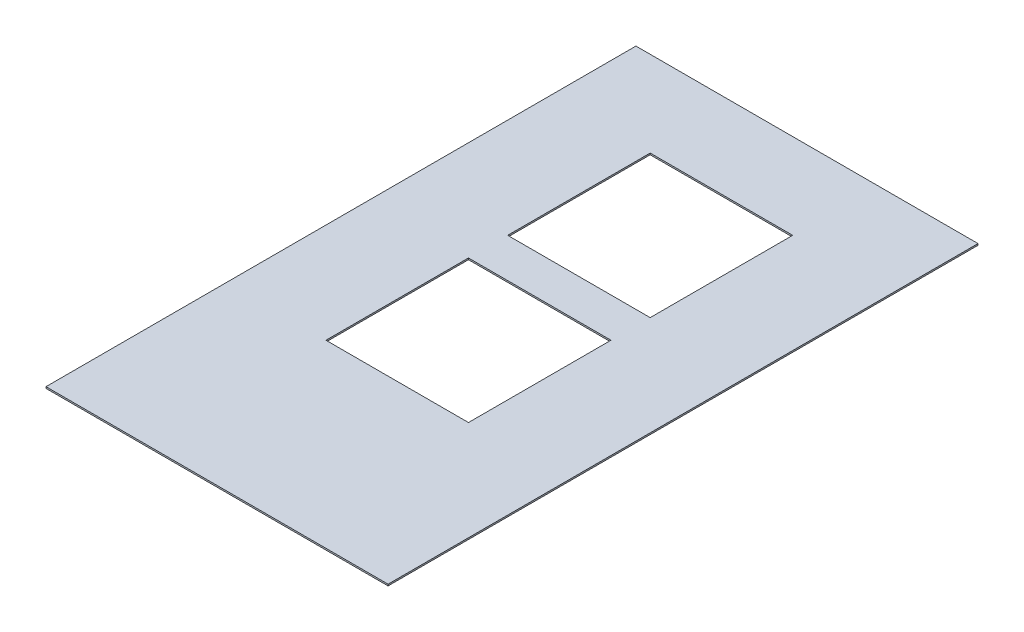
ISO-10303-21;
HEADER;
FILE_DESCRIPTION(('STEP AP214'),'2;1');
FILE_NAME('part.step','',(''),(''),'','','');
FILE_SCHEMA(('AUTOMOTIVE_DESIGN { 1 0 10303 214 1 1 1 1 }'));
ENDSEC;
DATA;
#1=APPLICATION_CONTEXT('core data for automotive mechanical design processes');
#2=APPLICATION_PROTOCOL_DEFINITION('international standard','automotive_design',2000,#1);
#3=PRODUCT_CONTEXT('',#1,'mechanical');
#4=PRODUCT('Part','Part','',(#3));
#5=PRODUCT_RELATED_PRODUCT_CATEGORY('part','',(#4));
#6=PRODUCT_DEFINITION_FORMATION('','',#4);
#7=PRODUCT_DEFINITION_CONTEXT('part definition',#1,'design');
#8=PRODUCT_DEFINITION('design','',#6,#7);
#9=PRODUCT_DEFINITION_SHAPE('','',#8);
#10=(LENGTH_UNIT() NAMED_UNIT(*) SI_UNIT(.MILLI.,.METRE.));
#11=(NAMED_UNIT(*) PLANE_ANGLE_UNIT() SI_UNIT($,.RADIAN.));
#12=(NAMED_UNIT(*) SI_UNIT($,.STERADIAN.) SOLID_ANGLE_UNIT());
#13=UNCERTAINTY_MEASURE_WITH_UNIT(LENGTH_MEASURE(1.E-05),#10,'distance_accuracy_value','');
#14=(GEOMETRIC_REPRESENTATION_CONTEXT(3) GLOBAL_UNCERTAINTY_ASSIGNED_CONTEXT((#13)) GLOBAL_UNIT_ASSIGNED_CONTEXT((#10,
#11,#12)) REPRESENTATION_CONTEXT('',''));
#15=CARTESIAN_POINT('',(0.,0.,0.));
#16=DIRECTION('',(0.,0.,1.));
#17=DIRECTION('',(1.,0.,0.));
#18=AXIS2_PLACEMENT_3D('',#15,#16,#17);
#19=CARTESIAN_POINT('',(609.6,5.55625,1051.321875));
#20=DIRECTION('',(-1.,0.,0.));
#21=DIRECTION('',(0.,0.,1.));
#22=AXIS2_PLACEMENT_3D('',#19,#20,#21);
#23=PLANE('',#22);
#24=DIRECTION('',(0.,0.,-1.));
#25=VECTOR('',#24,1.);
#26=CARTESIAN_POINT('',(609.6,0.,1051.321875));
#27=LINE('',#26,#25);
#28=CARTESIAN_POINT('',(609.6,0.,1051.321875));
#29=VERTEX_POINT('',#28);
#30=CARTESIAN_POINT('',(609.6,0.,-1051.321875));
#31=VERTEX_POINT('',#30);
#32=EDGE_CURVE('E159',#29,#31,#27,.T.);
#33=ORIENTED_EDGE('',*,*,#32,.T.);
#34=DIRECTION('',(0.,-1.,0.));
#35=VECTOR('',#34,1.);
#36=CARTESIAN_POINT('',(609.6,5.55625,-1051.321875));
#37=LINE('',#36,#35);
#38=CARTESIAN_POINT('',(609.6,5.55625,-1051.321875));
#39=VERTEX_POINT('',#38);
#40=EDGE_CURVE('E206',#39,#31,#37,.T.);
#41=ORIENTED_EDGE('',*,*,#40,.F.);
#42=DIRECTION('',(0.,0.,-1.));
#43=VECTOR('',#42,1.);
#44=CARTESIAN_POINT('',(609.6,5.55625,1051.321875));
#45=LINE('',#44,#43);
#46=CARTESIAN_POINT('',(609.6,5.55625,1051.321875));
#47=VERTEX_POINT('',#46);
#48=EDGE_CURVE('E180',#47,#39,#45,.T.);
#49=ORIENTED_EDGE('',*,*,#48,.F.);
#50=DIRECTION('',(0.,-1.,0.));
#51=VECTOR('',#50,1.);
#52=CARTESIAN_POINT('',(609.6,5.55625,1051.321875));
#53=LINE('',#52,#51);
#54=EDGE_CURVE('E190',#47,#29,#53,.T.);
#55=ORIENTED_EDGE('',*,*,#54,.T.);
#56=EDGE_LOOP('',(#33,#41,#49,#55));
#57=FACE_BOUND('',#56,.T.);
#58=ADVANCED_FACE('F39',(#57),#23,.F.);
#59=CARTESIAN_POINT('',(-609.6,5.55625,-1051.321875));
#60=DIRECTION('',(0.,0.,1.));
#61=DIRECTION('',(1.,0.,0.));
#62=AXIS2_PLACEMENT_3D('',#59,#60,#61);
#63=PLANE('',#62);
#64=DIRECTION('',(-1.,0.,0.));
#65=VECTOR('',#64,1.);
#66=CARTESIAN_POINT('',(-609.6,0.,-1051.321875));
#67=LINE('',#66,#65);
#68=CARTESIAN_POINT('',(-609.6,0.,-1051.321875));
#69=VERTEX_POINT('',#68);
#70=EDGE_CURVE('E193',#31,#69,#67,.T.);
#71=ORIENTED_EDGE('',*,*,#70,.T.);
#72=DIRECTION('',(0.,-1.,0.));
#73=VECTOR('',#72,1.);
#74=CARTESIAN_POINT('',(-609.6,5.55625,-1051.321875));
#75=LINE('',#74,#73);
#76=CARTESIAN_POINT('',(-609.6,5.55625,-1051.321875));
#77=VERTEX_POINT('',#76);
#78=EDGE_CURVE('E203',#77,#69,#75,.T.);
#79=ORIENTED_EDGE('',*,*,#78,.F.);
#80=DIRECTION('',(-1.,0.,0.));
#81=VECTOR('',#80,1.);
#82=CARTESIAN_POINT('',(-609.6,5.55625,-1051.321875));
#83=LINE('',#82,#81);
#84=EDGE_CURVE('E183',#39,#77,#83,.T.);
#85=ORIENTED_EDGE('',*,*,#84,.F.);
#86=ORIENTED_EDGE('',*,*,#40,.T.);
#87=EDGE_LOOP('',(#71,#79,#85,#86));
#88=FACE_BOUND('',#87,.T.);
#89=ADVANCED_FACE('F238',(#88),#63,.F.);
#90=CARTESIAN_POINT('',(-609.6,5.55625,1051.321875));
#91=DIRECTION('',(1.,0.,0.));
#92=DIRECTION('',(0.,0.,-1.));
#93=AXIS2_PLACEMENT_3D('',#90,#91,#92);
#94=PLANE('',#93);
#95=DIRECTION('',(0.,0.,1.));
#96=VECTOR('',#95,1.);
#97=CARTESIAN_POINT('',(-609.6,0.,1051.321875));
#98=LINE('',#97,#96);
#99=CARTESIAN_POINT('',(-609.6,0.,1051.321875));
#100=VERTEX_POINT('',#99);
#101=EDGE_CURVE('E195',#69,#100,#98,.T.);
#102=ORIENTED_EDGE('',*,*,#101,.T.);
#103=DIRECTION('',(0.,-1.,0.));
#104=VECTOR('',#103,1.);
#105=CARTESIAN_POINT('',(-609.6,5.55625,1051.321875));
#106=LINE('',#105,#104);
#107=CARTESIAN_POINT('',(-609.6,5.55625,1051.321875));
#108=VERTEX_POINT('',#107);
#109=EDGE_CURVE('E200',#108,#100,#106,.T.);
#110=ORIENTED_EDGE('',*,*,#109,.F.);
#111=DIRECTION('',(0.,0.,1.));
#112=VECTOR('',#111,1.);
#113=CARTESIAN_POINT('',(-609.6,5.55625,1051.321875));
#114=LINE('',#113,#112);
#115=EDGE_CURVE('E186',#77,#108,#114,.T.);
#116=ORIENTED_EDGE('',*,*,#115,.F.);
#117=ORIENTED_EDGE('',*,*,#78,.T.);
#118=EDGE_LOOP('',(#102,#110,#116,#117));
#119=FACE_BOUND('',#118,.T.);
#120=ADVANCED_FACE('F243',(#119),#94,.F.);
#121=CARTESIAN_POINT('',(-609.6,5.55625,1051.321875));
#122=DIRECTION('',(0.,0.,-1.));
#123=DIRECTION('',(-1.,0.,0.));
#124=AXIS2_PLACEMENT_3D('',#121,#122,#123);
#125=PLANE('',#124);
#126=DIRECTION('',(1.,0.,0.));
#127=VECTOR('',#126,1.);
#128=CARTESIAN_POINT('',(-609.6,0.,1051.321875));
#129=LINE('',#128,#127);
#130=EDGE_CURVE('E184',#100,#29,#129,.T.);
#131=ORIENTED_EDGE('',*,*,#130,.T.);
#132=ORIENTED_EDGE('',*,*,#54,.F.);
#133=DIRECTION('',(1.,0.,0.));
#134=VECTOR('',#133,1.);
#135=CARTESIAN_POINT('',(-609.6,5.55625,1051.321875));
#136=LINE('',#135,#134);
#137=EDGE_CURVE('E188',#108,#47,#136,.T.);
#138=ORIENTED_EDGE('',*,*,#137,.F.);
#139=ORIENTED_EDGE('',*,*,#109,.T.);
#140=EDGE_LOOP('',(#131,#132,#138,#139));
#141=FACE_BOUND('',#140,.T.);
#142=ADVANCED_FACE('F258',(#141),#125,.F.);
#143=CARTESIAN_POINT('',(0.,5.55625,0.));
#144=DIRECTION('',(0.,-1.,0.));
#145=DIRECTION('',(0.,0.,-1.));
#146=AXIS2_PLACEMENT_3D('',#143,#144,#145);
#147=PLANE('',#146);
#148=DIRECTION('',(-1.,0.,0.));
#149=VECTOR('',#148,1.);
#150=CARTESIAN_POINT('',(254.000000000144,5.55625,-238.521875000141));
#151=LINE('',#150,#149);
#152=CARTESIAN_POINT('',(254.000000000144,5.55625,-238.521875000141));
#153=VERTEX_POINT('',#152);
#154=CARTESIAN_POINT('',(-253.999999999856,5.55625,-238.521875000141));
#155=VERTEX_POINT('',#154);
#156=EDGE_CURVE('E139',#153,#155,#151,.T.);
#157=ORIENTED_EDGE('',*,*,#156,.T.);
#158=DIRECTION('',(0.,0.,-1.));
#159=VECTOR('',#158,1.);
#160=CARTESIAN_POINT('',(-253.999999999856,5.55625,-238.521875000141));
#161=LINE('',#160,#159);
#162=CARTESIAN_POINT('',(-253.999999999856,5.55625,-746.521875000141));
#163=VERTEX_POINT('',#162);
#164=EDGE_CURVE('E133',#155,#163,#161,.T.);
#165=ORIENTED_EDGE('',*,*,#164,.T.);
#166=DIRECTION('',(1.,0.,0.));
#167=VECTOR('',#166,1.);
#168=CARTESIAN_POINT('',(254.000000000144,5.55625,-746.521875000141));
#169=LINE('',#168,#167);
#170=CARTESIAN_POINT('',(254.000000000144,5.55625,-746.521875000141));
#171=VERTEX_POINT('',#170);
#172=EDGE_CURVE('E142',#163,#171,#169,.T.);
#173=ORIENTED_EDGE('',*,*,#172,.T.);
#174=DIRECTION('',(0.,0.,1.));
#175=VECTOR('',#174,1.);
#176=CARTESIAN_POINT('',(254.000000000144,5.55625,-238.521875000141));
#177=LINE('',#176,#175);
#178=EDGE_CURVE('E53',#171,#153,#177,.T.);
#179=ORIENTED_EDGE('',*,*,#178,.T.);
#180=EDGE_LOOP('',(#157,#165,#173,#179));
#181=FACE_BOUND('',#180,.T.);
#182=DIRECTION('',(-1.,0.,0.));
#183=VECTOR('',#182,1.);
#184=CARTESIAN_POINT('',(254.,5.55625,409.178125));
#185=LINE('',#184,#183);
#186=CARTESIAN_POINT('',(254.,5.55625,409.178125));
#187=VERTEX_POINT('',#186);
#188=CARTESIAN_POINT('',(-254.,5.55625,409.178125));
#189=VERTEX_POINT('',#188);
#190=EDGE_CURVE('E166',#187,#189,#185,.T.);
#191=ORIENTED_EDGE('',*,*,#190,.T.);
#192=DIRECTION('',(0.,0.,-1.));
#193=VECTOR('',#192,1.);
#194=CARTESIAN_POINT('',(-254.,5.55625,409.178125));
#195=LINE('',#194,#193);
#196=CARTESIAN_POINT('',(-254.,5.55625,-98.8218749999997));
#197=VERTEX_POINT('',#196);
#198=EDGE_CURVE('E149',#189,#197,#195,.T.);
#199=ORIENTED_EDGE('',*,*,#198,.T.);
#200=DIRECTION('',(1.,0.,0.));
#201=VECTOR('',#200,1.);
#202=CARTESIAN_POINT('',(254.,5.55625,-98.8218749999997));
#203=LINE('',#202,#201);
#204=CARTESIAN_POINT('',(254.,5.55625,-98.8218749999997));
#205=VERTEX_POINT('',#204);
#206=EDGE_CURVE('E152',#197,#205,#203,.T.);
#207=ORIENTED_EDGE('',*,*,#206,.T.);
#208=DIRECTION('',(0.,0.,1.));
#209=VECTOR('',#208,1.);
#210=CARTESIAN_POINT('',(254.,5.55625,409.178125));
#211=LINE('',#210,#209);
#212=EDGE_CURVE('E61',#205,#187,#211,.T.);
#213=ORIENTED_EDGE('',*,*,#212,.T.);
#214=EDGE_LOOP('',(#191,#199,#207,#213));
#215=FACE_BOUND('',#214,.T.);
#216=ORIENTED_EDGE('',*,*,#48,.T.);
#217=ORIENTED_EDGE('',*,*,#84,.T.);
#218=ORIENTED_EDGE('',*,*,#115,.T.);
#219=ORIENTED_EDGE('',*,*,#137,.T.);
#220=EDGE_LOOP('',(#216,#217,#218,#219));
#221=FACE_BOUND('',#220,.T.);
#222=ADVANCED_FACE('F146',(#181,#215,#221),#147,.F.);
#223=CARTESIAN_POINT('',(0.,0.,0.));
#224=DIRECTION('',(0.,-1.,0.));
#225=DIRECTION('',(0.,0.,-1.));
#226=AXIS2_PLACEMENT_3D('',#223,#224,#225);
#227=PLANE('',#226);
#228=DIRECTION('',(0.,0.,-1.));
#229=VECTOR('',#228,1.);
#230=CARTESIAN_POINT('',(-253.999999999856,0.,0.));
#231=LINE('',#230,#229);
#232=CARTESIAN_POINT('',(-253.999999999856,0.,-238.521875000141));
#233=VERTEX_POINT('',#232);
#234=CARTESIAN_POINT('',(-253.999999999856,0.,-746.521875000141));
#235=VERTEX_POINT('',#234);
#236=EDGE_CURVE('E11',#233,#235,#231,.T.);
#237=ORIENTED_EDGE('',*,*,#236,.F.);
#238=DIRECTION('',(-1.,0.,0.));
#239=VECTOR('',#238,1.);
#240=CARTESIAN_POINT('',(0.,0.,-238.521875000141));
#241=LINE('',#240,#239);
#242=CARTESIAN_POINT('',(254.000000000144,0.,-238.521875000141));
#243=VERTEX_POINT('',#242);
#244=EDGE_CURVE('E46',#243,#233,#241,.T.);
#245=ORIENTED_EDGE('',*,*,#244,.F.);
#246=DIRECTION('',(0.,0.,1.));
#247=VECTOR('',#246,1.);
#248=CARTESIAN_POINT('',(254.000000000144,0.,0.));
#249=LINE('',#248,#247);
#250=CARTESIAN_POINT('',(254.000000000144,0.,-746.521875000141));
#251=VERTEX_POINT('',#250);
#252=EDGE_CURVE('E220',#251,#243,#249,.T.);
#253=ORIENTED_EDGE('',*,*,#252,.F.);
#254=DIRECTION('',(1.,0.,0.));
#255=VECTOR('',#254,1.);
#256=CARTESIAN_POINT('',(0.,0.,-746.521875000141));
#257=LINE('',#256,#255);
#258=EDGE_CURVE('E218',#235,#251,#257,.T.);
#259=ORIENTED_EDGE('',*,*,#258,.F.);
#260=EDGE_LOOP('',(#237,#245,#253,#259));
#261=FACE_BOUND('',#260,.T.);
#262=DIRECTION('',(0.,0.,-1.));
#263=VECTOR('',#262,1.);
#264=CARTESIAN_POINT('',(-254.,0.,0.));
#265=LINE('',#264,#263);
#266=CARTESIAN_POINT('',(-254.,0.,409.178125));
#267=VERTEX_POINT('',#266);
#268=CARTESIAN_POINT('',(-254.,0.,-98.8218749999997));
#269=VERTEX_POINT('',#268);
#270=EDGE_CURVE('E215',#267,#269,#265,.T.);
#271=ORIENTED_EDGE('',*,*,#270,.F.);
#272=DIRECTION('',(-1.,0.,0.));
#273=VECTOR('',#272,1.);
#274=CARTESIAN_POINT('',(0.,0.,409.178125));
#275=LINE('',#274,#273);
#276=CARTESIAN_POINT('',(254.,0.,409.178125));
#277=VERTEX_POINT('',#276);
#278=EDGE_CURVE('E213',#277,#267,#275,.T.);
#279=ORIENTED_EDGE('',*,*,#278,.F.);
#280=DIRECTION('',(0.,0.,1.));
#281=VECTOR('',#280,1.);
#282=CARTESIAN_POINT('',(254.,0.,0.));
#283=LINE('',#282,#281);
#284=CARTESIAN_POINT('',(254.,0.,-98.8218749999997));
#285=VERTEX_POINT('',#284);
#286=EDGE_CURVE('E211',#285,#277,#283,.T.);
#287=ORIENTED_EDGE('',*,*,#286,.F.);
#288=DIRECTION('',(1.,0.,0.));
#289=VECTOR('',#288,1.);
#290=CARTESIAN_POINT('',(0.,0.,-98.8218749999997));
#291=LINE('',#290,#289);
#292=EDGE_CURVE('E209',#269,#285,#291,.T.);
#293=ORIENTED_EDGE('',*,*,#292,.F.);
#294=EDGE_LOOP('',(#271,#279,#287,#293));
#295=FACE_BOUND('',#294,.T.);
#296=ORIENTED_EDGE('',*,*,#32,.F.);
#297=ORIENTED_EDGE('',*,*,#130,.F.);
#298=ORIENTED_EDGE('',*,*,#101,.F.);
#299=ORIENTED_EDGE('',*,*,#70,.F.);
#300=EDGE_LOOP('',(#296,#297,#298,#299));
#301=FACE_BOUND('',#300,.T.);
#302=ADVANCED_FACE('F226',(#261,#295,#301),#227,.T.);
#303=CARTESIAN_POINT('',(-254.,5.55625,409.178125));
#304=DIRECTION('',(-1.,0.,0.));
#305=DIRECTION('',(0.,0.,1.));
#306=AXIS2_PLACEMENT_3D('',#303,#304,#305);
#307=PLANE('',#306);
#308=ORIENTED_EDGE('',*,*,#270,.T.);
#309=DIRECTION('',(0.,-1.,0.));
#310=VECTOR('',#309,1.);
#311=CARTESIAN_POINT('',(-254.,5.55625,-98.8218749999997));
#312=LINE('',#311,#310);
#313=EDGE_CURVE('E164',#197,#269,#312,.T.);
#314=ORIENTED_EDGE('',*,*,#313,.F.);
#315=ORIENTED_EDGE('',*,*,#198,.F.);
#316=DIRECTION('',(0.,-1.,0.));
#317=VECTOR('',#316,1.);
#318=CARTESIAN_POINT('',(-254.,5.55625,409.178125));
#319=LINE('',#318,#317);
#320=EDGE_CURVE('E172',#189,#267,#319,.T.);
#321=ORIENTED_EDGE('',*,*,#320,.T.);
#322=EDGE_LOOP('',(#308,#314,#315,#321));
#323=FACE_BOUND('',#322,.T.);
#324=ADVANCED_FACE('F269',(#323),#307,.F.);
#325=CARTESIAN_POINT('',(254.,5.55625,409.178125));
#326=DIRECTION('',(0.,0.,1.));
#327=DIRECTION('',(1.,0.,0.));
#328=AXIS2_PLACEMENT_3D('',#325,#326,#327);
#329=PLANE('',#328);
#330=ORIENTED_EDGE('',*,*,#278,.T.);
#331=ORIENTED_EDGE('',*,*,#320,.F.);
#332=ORIENTED_EDGE('',*,*,#190,.F.);
#333=DIRECTION('',(0.,-1.,0.));
#334=VECTOR('',#333,1.);
#335=CARTESIAN_POINT('',(254.,5.55625,409.178125));
#336=LINE('',#335,#334);
#337=EDGE_CURVE('E169',#187,#277,#336,.T.);
#338=ORIENTED_EDGE('',*,*,#337,.T.);
#339=EDGE_LOOP('',(#330,#331,#332,#338));
#340=FACE_BOUND('',#339,.T.);
#341=ADVANCED_FACE('F272',(#340),#329,.F.);
#342=CARTESIAN_POINT('',(254.,5.55625,409.178125));
#343=DIRECTION('',(1.,0.,0.));
#344=DIRECTION('',(0.,0.,-1.));
#345=AXIS2_PLACEMENT_3D('',#342,#343,#344);
#346=PLANE('',#345);
#347=ORIENTED_EDGE('',*,*,#286,.T.);
#348=ORIENTED_EDGE('',*,*,#337,.F.);
#349=ORIENTED_EDGE('',*,*,#212,.F.);
#350=DIRECTION('',(0.,-1.,0.));
#351=VECTOR('',#350,1.);
#352=CARTESIAN_POINT('',(254.,5.55625,-98.8218749999997));
#353=LINE('',#352,#351);
#354=EDGE_CURVE('E167',#205,#285,#353,.T.);
#355=ORIENTED_EDGE('',*,*,#354,.T.);
#356=EDGE_LOOP('',(#347,#348,#349,#355));
#357=FACE_BOUND('',#356,.T.);
#358=ADVANCED_FACE('F275',(#357),#346,.F.);
#359=CARTESIAN_POINT('',(254.,5.55625,-98.8218749999997));
#360=DIRECTION('',(0.,0.,-1.));
#361=DIRECTION('',(-1.,0.,0.));
#362=AXIS2_PLACEMENT_3D('',#359,#360,#361);
#363=PLANE('',#362);
#364=ORIENTED_EDGE('',*,*,#292,.T.);
#365=ORIENTED_EDGE('',*,*,#354,.F.);
#366=ORIENTED_EDGE('',*,*,#206,.F.);
#367=ORIENTED_EDGE('',*,*,#313,.T.);
#368=EDGE_LOOP('',(#364,#365,#366,#367));
#369=FACE_BOUND('',#368,.T.);
#370=ADVANCED_FACE('F279',(#369),#363,.F.);
#371=CARTESIAN_POINT('',(-253.999999999856,5.55625,-238.521875000141));
#372=DIRECTION('',(-1.,0.,0.));
#373=DIRECTION('',(0.,0.,1.));
#374=AXIS2_PLACEMENT_3D('',#371,#372,#373);
#375=PLANE('',#374);
#376=ORIENTED_EDGE('',*,*,#236,.T.);
#377=DIRECTION('',(0.,-1.,0.));
#378=VECTOR('',#377,1.);
#379=CARTESIAN_POINT('',(-253.999999999856,5.55625,-746.521875000141));
#380=LINE('',#379,#378);
#381=EDGE_CURVE('E128',#163,#235,#380,.T.);
#382=ORIENTED_EDGE('',*,*,#381,.F.);
#383=ORIENTED_EDGE('',*,*,#164,.F.);
#384=DIRECTION('',(0.,-1.,0.));
#385=VECTOR('',#384,1.);
#386=CARTESIAN_POINT('',(-253.999999999856,5.55625,-238.521875000141));
#387=LINE('',#386,#385);
#388=EDGE_CURVE('E157',#155,#233,#387,.T.);
#389=ORIENTED_EDGE('',*,*,#388,.T.);
#390=EDGE_LOOP('',(#376,#382,#383,#389));
#391=FACE_BOUND('',#390,.T.);
#392=ADVANCED_FACE('F130',(#391),#375,.F.);
#393=CARTESIAN_POINT('',(254.000000000144,5.55625,-238.521875000141));
#394=DIRECTION('',(0.,0.,1.));
#395=DIRECTION('',(1.,0.,0.));
#396=AXIS2_PLACEMENT_3D('',#393,#394,#395);
#397=PLANE('',#396);
#398=ORIENTED_EDGE('',*,*,#244,.T.);
#399=ORIENTED_EDGE('',*,*,#388,.F.);
#400=ORIENTED_EDGE('',*,*,#156,.F.);
#401=DIRECTION('',(0.,-1.,0.));
#402=VECTOR('',#401,1.);
#403=CARTESIAN_POINT('',(254.000000000144,5.55625,-238.521875000141));
#404=LINE('',#403,#402);
#405=EDGE_CURVE('E160',#153,#243,#404,.T.);
#406=ORIENTED_EDGE('',*,*,#405,.T.);
#407=EDGE_LOOP('',(#398,#399,#400,#406));
#408=FACE_BOUND('',#407,.T.);
#409=ADVANCED_FACE('F223',(#408),#397,.F.);
#410=CARTESIAN_POINT('',(254.000000000144,5.55625,-238.521875000141));
#411=DIRECTION('',(1.,0.,0.));
#412=DIRECTION('',(0.,0.,-1.));
#413=AXIS2_PLACEMENT_3D('',#410,#411,#412);
#414=PLANE('',#413);
#415=ORIENTED_EDGE('',*,*,#252,.T.);
#416=ORIENTED_EDGE('',*,*,#405,.F.);
#417=ORIENTED_EDGE('',*,*,#178,.F.);
#418=DIRECTION('',(0.,-1.,0.));
#419=VECTOR('',#418,1.);
#420=CARTESIAN_POINT('',(254.000000000144,5.55625,-746.521875000141));
#421=LINE('',#420,#419);
#422=EDGE_CURVE('E138',#171,#251,#421,.T.);
#423=ORIENTED_EDGE('',*,*,#422,.T.);
#424=EDGE_LOOP('',(#415,#416,#417,#423));
#425=FACE_BOUND('',#424,.T.);
#426=ADVANCED_FACE('F228',(#425),#414,.F.);
#427=CARTESIAN_POINT('',(254.000000000144,5.55625,-746.521875000141));
#428=DIRECTION('',(0.,0.,-1.));
#429=DIRECTION('',(-1.,0.,0.));
#430=AXIS2_PLACEMENT_3D('',#427,#428,#429);
#431=PLANE('',#430);
#432=ORIENTED_EDGE('',*,*,#258,.T.);
#433=ORIENTED_EDGE('',*,*,#422,.F.);
#434=ORIENTED_EDGE('',*,*,#172,.F.);
#435=ORIENTED_EDGE('',*,*,#381,.T.);
#436=EDGE_LOOP('',(#432,#433,#434,#435));
#437=FACE_BOUND('',#436,.T.);
#438=ADVANCED_FACE('F143',(#437),#431,.F.);
#439=CLOSED_SHELL('',(#58,#89,#120,#142,#222,#302,#324,#341,#358,#370,#392,#409,#426,#438));
#440=MANIFOLD_SOLID_BREP('B2',#439);
#441=ADVANCED_BREP_SHAPE_REPRESENTATION('',(#18,#440),#14);
#442=SHAPE_DEFINITION_REPRESENTATION(#9,#441);
ENDSEC;
END-ISO-10303-21;
